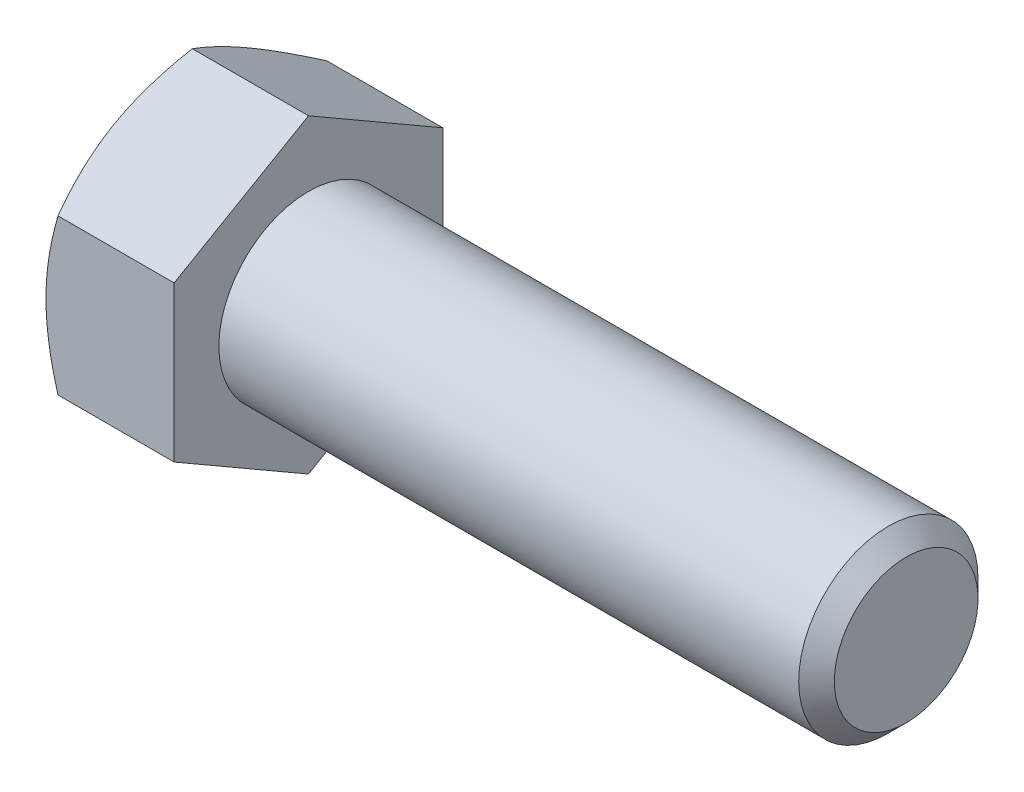
ISO-10303-21;
HEADER;
FILE_DESCRIPTION(('STEP AP214'),'2;1');
FILE_NAME('part.step','',(''),(''),'','','');
FILE_SCHEMA(('AUTOMOTIVE_DESIGN { 1 0 10303 214 1 1 1 1 }'));
ENDSEC;
DATA;
#1=APPLICATION_CONTEXT('core data for automotive mechanical design processes');
#2=APPLICATION_PROTOCOL_DEFINITION('international standard','automotive_design',2000,#1);
#3=PRODUCT_CONTEXT('',#1,'mechanical');
#4=PRODUCT('Part','Part','',(#3));
#5=PRODUCT_RELATED_PRODUCT_CATEGORY('part','',(#4));
#6=PRODUCT_DEFINITION_FORMATION('','',#4);
#7=PRODUCT_DEFINITION_CONTEXT('part definition',#1,'design');
#8=PRODUCT_DEFINITION('design','',#6,#7);
#9=PRODUCT_DEFINITION_SHAPE('','',#8);
#10=(LENGTH_UNIT() NAMED_UNIT(*) SI_UNIT(.MILLI.,.METRE.));
#11=(NAMED_UNIT(*) PLANE_ANGLE_UNIT() SI_UNIT($,.RADIAN.));
#12=(NAMED_UNIT(*) SI_UNIT($,.STERADIAN.) SOLID_ANGLE_UNIT());
#13=UNCERTAINTY_MEASURE_WITH_UNIT(LENGTH_MEASURE(1.E-05),#10,'distance_accuracy_value','');
#14=(GEOMETRIC_REPRESENTATION_CONTEXT(3) GLOBAL_UNCERTAINTY_ASSIGNED_CONTEXT((#13)) GLOBAL_UNIT_ASSIGNED_CONTEXT((#10,
#11,#12)) REPRESENTATION_CONTEXT('',''));
#15=CARTESIAN_POINT('',(0.,0.,0.));
#16=DIRECTION('',(0.,0.,1.));
#17=DIRECTION('',(1.,0.,0.));
#18=AXIS2_PLACEMENT_3D('',#15,#16,#17);
#19=CARTESIAN_POINT('',(6.8072,4.12077981131403,-7.1374));
#20=DIRECTION('',(0.,-0.866025403784438,0.500000000000001));
#21=DIRECTION('',(0.,-0.500000000000001,-0.866025403784438));
#22=AXIS2_PLACEMENT_3D('',#19,#20,#21);
#23=PLANE('',#22);
#24=CARTESIAN_POINT('',(0.637553523420348,8.24167509268191,0.000200000000000209));
#25=CARTESIAN_POINT('',(0.585265389565358,8.15109571898021,-0.15668807736911));
#26=CARTESIAN_POINT('',(0.535350289912886,8.06017862158373,-0.314161109336511));
#27=CARTESIAN_POINT('',(0.44091973939481,7.87760608276958,-0.63038602262945));
#28=CARTESIAN_POINT('',(0.396406617864103,7.78595034088604,-0.789138424377165));
#29=CARTESIAN_POINT('',(0.2718439466046,7.50951559742938,-1.26793744502137));
#30=CARTESIAN_POINT('',(0.200994122533561,7.32364541554993,-1.58987404364865));
#31=CARTESIAN_POINT('',(0.117914357261566,7.04549407114397,-2.07164630435335));
#32=CARTESIAN_POINT('',(0.0942473375753675,6.95404399131371,-2.23004248897558));
#33=CARTESIAN_POINT('',(0.0545611977075645,6.77073061920728,-2.54755056317072));
#34=CARTESIAN_POINT('',(0.0385414017966338,6.67886736416472,-2.70666238825308));
#35=CARTESIAN_POINT('',(0.0145579786669821,6.49498130931768,-3.02516237805154));
#36=CARTESIAN_POINT('',(0.00658520869042847,6.40295880983915,-3.18455002258784));
#37=CARTESIAN_POINT('',(-0.00114175893561545,6.21883388819856,-3.50346374180898));
#38=CARTESIAN_POINT('',(-0.000896210482461237,6.12673146859347,-3.66298981206503));
#39=CARTESIAN_POINT('',(0.0110730517201772,5.87440161908354,-4.10003793168242));
#40=CARTESIAN_POINT('',(0.0311658852990922,5.71425679021456,-4.37741691185292));
#41=CARTESIAN_POINT('',(0.0948800883359065,5.39503079963205,-4.93033254663833));
#42=CARTESIAN_POINT('',(0.13852323430896,5.23595076056063,-5.20586725678008));
#43=CARTESIAN_POINT('',(0.247618299095075,4.91608234409664,-5.75989560583231));
#44=CARTESIAN_POINT('',(0.31353243599271,4.75533432745402,-6.03831933787325));
#45=CARTESIAN_POINT('',(0.463130880450463,4.43623548204411,-6.59101475075978));
#46=CARTESIAN_POINT('',(0.546780048637372,4.27788056676996,-6.86529350964288));
#47=CARTESIAN_POINT('',(0.637553523420342,4.12066434126019,-7.1376));
#48=B_SPLINE_CURVE_WITH_KNOTS('',3,(#24,#25,#26,#27,#28,#29,#30,#31,#32,#33,#34,#35,#36,#37,#38,
#39,#40,#41,#42,#43,#44,#45,#46,#47),.UNSPECIFIED.,.F.,.F.,(4,2,2,2,2,2,2,2,2,2,2,4),(0.,
0.565616271543687,1.13147557690344,2.26554547664276,2.81869146049269,3.37178855781927,
3.9242565351942,4.4767074445971,5.43845614829341,6.40109569003607,7.3850851165131,
8.36714283329691),.UNSPECIFIED.);
#49=CARTESIAN_POINT('',(0.63748685535263,8.24155962262807,0.));
#50=VERTEX_POINT('',#49);
#51=CARTESIAN_POINT('',(0.,6.18116971697105,-3.56870000000001));
#52=VERTEX_POINT('',#51);
#53=EDGE_CURVE('E49',#50,#52,#48,.T.);
#54=ORIENTED_EDGE('',*,*,#53,.F.);
#55=DIRECTION('',(-1.,0.,0.));
#56=VECTOR('',#55,1.);
#57=CARTESIAN_POINT('',(6.8072,8.24155962262807,0.));
#58=LINE('',#57,#56);
#59=CARTESIAN_POINT('',(6.8072,8.24155962262807,0.));
#60=VERTEX_POINT('',#59);
#61=EDGE_CURVE('E145',#60,#50,#58,.T.);
#62=ORIENTED_EDGE('',*,*,#61,.F.);
#63=DIRECTION('',(0.,0.500000000000001,0.866025403784438));
#64=VECTOR('',#63,1.);
#65=CARTESIAN_POINT('',(6.8072,4.12077981131403,-7.1374));
#66=LINE('',#65,#64);
#67=CARTESIAN_POINT('',(6.8072,4.12077981131403,-7.1374));
#68=VERTEX_POINT('',#67);
#69=EDGE_CURVE('E230',#68,#60,#66,.T.);
#70=ORIENTED_EDGE('',*,*,#69,.F.);
#71=DIRECTION('',(-1.,0.,0.));
#72=VECTOR('',#71,1.);
#73=CARTESIAN_POINT('',(6.8072,4.12077981131403,-7.1374));
#74=LINE('',#73,#72);
#75=CARTESIAN_POINT('',(0.637486855352625,4.12077981131403,-7.1374));
#76=VERTEX_POINT('',#75);
#77=EDGE_CURVE('E133',#68,#76,#74,.T.);
#78=ORIENTED_EDGE('',*,*,#77,.T.);
#79=EDGE_CURVE('E127',#52,#76,#48,.T.);
#80=ORIENTED_EDGE('',*,*,#79,.F.);
#81=EDGE_LOOP('',(#54,#62,#70,#78,#80));
#82=FACE_BOUND('',#81,.T.);
#83=ADVANCED_FACE('F33',(#82),#23,.F.);
#84=CARTESIAN_POINT('',(6.8072,8.24155962262807,0.));
#85=DIRECTION('',(0.,-0.866025403784438,-0.500000000000001));
#86=DIRECTION('',(0.,0.500000000000001,-0.866025403784438));
#87=AXIS2_PLACEMENT_3D('',#84,#85,#86);
#88=PLANE('',#87);
#89=CARTESIAN_POINT('',(0.637553523420344,4.12066434126019,7.1376));
#90=CARTESIAN_POINT('',(0.585265389565354,4.21124371496189,6.98071192263089));
#91=CARTESIAN_POINT('',(0.535350289912882,4.30216081235838,6.82323889066349));
#92=CARTESIAN_POINT('',(0.440919739394807,4.48473335117252,6.50701397737055));
#93=CARTESIAN_POINT('',(0.3964066178641,4.57638909305606,6.34826157562283));
#94=CARTESIAN_POINT('',(0.271843946604597,4.85282383651273,5.86946255497863));
#95=CARTESIAN_POINT('',(0.200994122533559,5.03869401839218,5.54752595635135));
#96=CARTESIAN_POINT('',(0.117914357261565,5.31684536279813,5.06575369564665));
#97=CARTESIAN_POINT('',(0.0942473375753667,5.40829544262839,4.90735751102442));
#98=CARTESIAN_POINT('',(0.0545611977075642,5.59160881473483,4.58984943682929));
#99=CARTESIAN_POINT('',(0.0385414017966335,5.68347206977738,4.43073761174693));
#100=CARTESIAN_POINT('',(0.014557978666982,5.86735812462442,4.11223762194846));
#101=CARTESIAN_POINT('',(0.00658520869042849,5.95938062410295,3.95284997741216));
#102=CARTESIAN_POINT('',(-0.00114175893561497,6.14350554574354,3.63393625819102));
#103=CARTESIAN_POINT('',(-0.000896210482460466,6.23560796534863,3.47441018793497));
#104=CARTESIAN_POINT('',(0.0110730517201786,6.48793781485856,3.03736206831758));
#105=CARTESIAN_POINT('',(0.0311658852990939,6.64808264372754,2.75998308814708));
#106=CARTESIAN_POINT('',(0.0948800883359091,6.96730863431005,2.20706745336167));
#107=CARTESIAN_POINT('',(0.138523234308963,7.12638867338148,1.93153274321992));
#108=CARTESIAN_POINT('',(0.247618299095079,7.44625708984546,1.37750439416769));
#109=CARTESIAN_POINT('',(0.313532435992715,7.60700510648809,1.09908066212674));
#110=CARTESIAN_POINT('',(0.463130880450468,7.92610395189799,0.546385249240216));
#111=CARTESIAN_POINT('',(0.546780048637378,8.08445886717215,0.272106490357122));
#112=CARTESIAN_POINT('',(0.637553523420348,8.24167509268191,-0.000200000000000023));
#113=B_SPLINE_CURVE_WITH_KNOTS('',3,(#89,#90,#91,#92,#93,#94,#95,#96,#97,#98,#99,#100,#101,#102,
#103,#104,#105,#106,#107,#108,#109,#110,#111,#112),.UNSPECIFIED.,.F.,.F.,(4,2,2,2,2,2,2,2,2,2,2,
4),(0.,0.565616271543686,1.13147557690344,2.26554547664276,2.81869146049268,3.37178855781927,
3.92425653519419,4.4767074445971,5.43845614829341,6.40109569003607,7.3850851165131,
8.36714283329691),.UNSPECIFIED.);
#114=CARTESIAN_POINT('',(0.637486855352626,4.12077981131403,7.1374));
#115=VERTEX_POINT('',#114);
#116=CARTESIAN_POINT('',(0.,6.18116971697105,3.56870000000001));
#117=VERTEX_POINT('',#116);
#118=EDGE_CURVE('E56',#115,#117,#113,.T.);
#119=ORIENTED_EDGE('',*,*,#118,.F.);
#120=DIRECTION('',(-1.,0.,0.));
#121=VECTOR('',#120,1.);
#122=CARTESIAN_POINT('',(6.8072,4.12077981131403,7.1374));
#123=LINE('',#122,#121);
#124=CARTESIAN_POINT('',(6.8072,4.12077981131403,7.1374));
#125=VERTEX_POINT('',#124);
#126=EDGE_CURVE('E143',#125,#115,#123,.T.);
#127=ORIENTED_EDGE('',*,*,#126,.F.);
#128=DIRECTION('',(0.,-0.500000000000001,0.866025403784438));
#129=VECTOR('',#128,1.);
#130=CARTESIAN_POINT('',(6.8072,8.24155962262807,0.));
#131=LINE('',#130,#129);
#132=EDGE_CURVE('E228',#60,#125,#131,.T.);
#133=ORIENTED_EDGE('',*,*,#132,.F.);
#134=ORIENTED_EDGE('',*,*,#61,.T.);
#135=EDGE_CURVE('E160',#117,#50,#113,.T.);
#136=ORIENTED_EDGE('',*,*,#135,.F.);
#137=EDGE_LOOP('',(#119,#127,#133,#134,#136));
#138=FACE_BOUND('',#137,.T.);
#139=ADVANCED_FACE('F166',(#138),#88,.F.);
#140=CARTESIAN_POINT('',(6.8072,4.12077981131403,7.1374));
#141=DIRECTION('',(0.,0.,-1.));
#142=DIRECTION('',(-1.,0.,0.));
#143=AXIS2_PLACEMENT_3D('',#140,#141,#142);
#144=PLANE('',#143);
#145=CARTESIAN_POINT('',(3.51793891464087,-11.1403587268437,7.1374));
#146=CARTESIAN_POINT('',(3.36611761361542,-10.8279722926893,7.1374));
#147=CARTESIAN_POINT('',(3.21573167435817,-10.5148763007017,7.1374));
#148=CARTESIAN_POINT('',(2.91863653133452,-9.88688803265219,7.1374));
#149=CARTESIAN_POINT('',(2.77192789362364,-9.57199548909055,7.1374));
#150=CARTESIAN_POINT('',(2.48227074397641,-8.93844907707203,7.1374));
#151=CARTESIAN_POINT('',(2.33934643030355,-8.61978410734441,7.1374));
#152=CARTESIAN_POINT('',(2.05925336317275,-7.97994405772779,7.1374));
#153=CARTESIAN_POINT('',(1.92208434228598,-7.65876909529409,7.1374));
#154=CARTESIAN_POINT('',(1.65065378230837,-7.00284865103085,7.1374));
#155=CARTESIAN_POINT('',(1.51663374065787,-6.66800268560584,7.1374));
#156=CARTESIAN_POINT('',(1.25856485288051,-5.99442084818065,7.1374));
#157=CARTESIAN_POINT('',(1.13451711533335,-5.6556845484785,7.1374));
#158=CARTESIAN_POINT('',(0.899596727677592,-4.97438980758155,7.1374));
#159=CARTESIAN_POINT('',(0.788698036742921,-4.63184044199148,7.1374));
#160=CARTESIAN_POINT('',(0.583585288609216,-3.94184101121261,7.1374));
#161=CARTESIAN_POINT('',(0.489366053461916,-3.5943925031972,7.1374));
#162=CARTESIAN_POINT('',(0.32258511977529,-2.89623643412329,7.1374));
#163=CARTESIAN_POINT('',(0.249906108267923,-2.54555766855628,7.1374));
#164=CARTESIAN_POINT('',(0.160162927876227,-2.01629019056175,7.1374));
#165=CARTESIAN_POINT('',(0.133459926561135,-1.83931395899739,7.1374));
#166=CARTESIAN_POINT('',(0.0870009608751862,-1.48445773938035,7.1374));
#167=CARTESIAN_POINT('',(0.0672443235865576,-1.3065778405635,7.1374));
#168=CARTESIAN_POINT('',(0.0353233928817906,-0.952509042934673,7.1374));
#169=CARTESIAN_POINT('',(0.0230620606560365,-0.776328928434244,7.1374));
#170=CARTESIAN_POINT('',(0.00600431660240801,-0.423607840789672,7.1374));
#171=CARTESIAN_POINT('',(0.0012077787227121,-0.247066873789356,7.1374));
#172=CARTESIAN_POINT('',(-0.000805707966080995,0.106061109313541,7.1374));
#173=CARTESIAN_POINT('',(0.0019774074548587,0.282648125793665,7.1374));
#174=CARTESIAN_POINT('',(0.0150543642253245,0.635545980126706,7.1374));
#175=CARTESIAN_POINT('',(0.0253485677088153,0.811856804252738,7.1374));
#176=CARTESIAN_POINT('',(0.0587173546676623,1.23335791869126,7.1374));
#177=CARTESIAN_POINT('',(0.0852317102922988,1.47828183508494,7.1374));
#178=CARTESIAN_POINT('',(0.151325348901078,1.96634766484074,7.1374));
#179=CARTESIAN_POINT('',(0.190906342916657,2.20948934056,7.1374));
#180=CARTESIAN_POINT('',(0.327153349211707,2.93593608611635,7.1374));
#181=CARTESIAN_POINT('',(0.441300495017732,3.41600789467397,7.1374));
#182=CARTESIAN_POINT('',(0.639740105584513,4.1340978033711,7.1374));
#183=CARTESIAN_POINT('',(0.711386839279739,4.37582477933243,7.1374));
#184=CARTESIAN_POINT('',(0.862240726867137,4.85693123459408,7.1374));
#185=CARTESIAN_POINT('',(0.941447936163005,5.09631069667749,7.1374));
#186=CARTESIAN_POINT('',(1.10614180608764,5.57279746249284,7.1374));
#187=CARTESIAN_POINT('',(1.19162653724197,5.809905439274,7.1374));
#188=CARTESIAN_POINT('',(1.36785754588297,6.28214651090287,7.1374));
#189=CARTESIAN_POINT('',(1.4586037216663,6.51727964382365,7.1374));
#190=CARTESIAN_POINT('',(1.70099135878086,7.12822933634872,7.1374));
#191=CARTESIAN_POINT('',(1.85611245200932,7.50266378649048,7.1374));
#192=CARTESIAN_POINT('',(2.17492034788947,8.24788094227112,7.1374));
#193=CARTESIAN_POINT('',(2.338607954525,8.61866330125998,7.1374));
#194=CARTESIAN_POINT('',(2.67260301704527,9.35737269718075,7.1374));
#195=CARTESIAN_POINT('',(2.8429126440593,9.7252987493811,7.1374));
#196=CARTESIAN_POINT('',(3.18863367809308,10.4587232704181,7.1374));
#197=CARTESIAN_POINT('',(3.36404491157502,10.8242218213112,7.1374));
#198=CARTESIAN_POINT('',(3.7191549662705,11.553777334436,7.1374));
#199=CARTESIAN_POINT('',(3.89885959822867,11.9178314626509,7.1374));
#200=CARTESIAN_POINT('',(4.26150568432078,12.6443245246618,7.1374));
#201=CARTESIAN_POINT('',(4.44444716083244,13.0067634472695,7.1374));
#202=CARTESIAN_POINT('',(4.81291716764718,13.7302353242129,7.1374));
#203=CARTESIAN_POINT('',(4.99844519827985,14.0912685333268,7.1374));
#204=CARTESIAN_POINT('',(5.37165471040538,14.8122208146436,7.1374));
#205=CARTESIAN_POINT('',(5.55933620037513,15.1721398824536,7.1374));
#206=CARTESIAN_POINT('',(6.08751400276292,16.1789579520409,7.1374));
#207=CARTESIAN_POINT('',(6.43000254365915,16.8248116492745,7.1374));
#208=CARTESIAN_POINT('',(7.11919785487999,18.1143032770824,7.1374));
#209=CARTESIAN_POINT('',(7.46590484738288,18.7579410886393,7.1374));
#210=CARTESIAN_POINT('',(8.16140637459832,20.0415314633598,7.1374));
#211=CARTESIAN_POINT('',(8.51019123426675,20.6814892741017,7.1374));
#212=CARTESIAN_POINT('',(9.21019417047445,21.9600146152104,7.1374));
#213=CARTESIAN_POINT('',(9.56141207357471,22.598582240497,7.1374));
#214=CARTESIAN_POINT('',(9.9135191344137,23.2366555668876,7.1374));
#215=B_SPLINE_CURVE_WITH_KNOTS('',3,(#145,#146,#147,#148,#149,#150,#151,#152,#153,#154,#155,
#156,#157,#158,#159,#160,#161,#162,#163,#164,#165,#166,#167,#168,#169,#170,#171,#172,#173,#174,
#175,#176,#177,#178,#179,#180,#181,#182,#183,#184,#185,#186,#187,#188,#189,#190,#191,#192,#193,
#194,#195,#196,#197,#198,#199,#200,#201,#202,#203,#204,#205,#206,#207,#208,#209,#210,#211,#212,
#213,#214),.UNSPECIFIED.,.F.,.F.,(4,2,2,2,2,2,2,2,2,2,2,2,2,2,2,2,2,2,2,2,2,2,2,2,2,2,2,2,2,2,2,
2,2,2,4),(0.,1.0419888362068,2.08413709519682,3.13183784368231,4.17948985504911,
5.26137797247103,6.34338619307611,7.42321444996099,8.50270689628368,9.57620733057732,
10.113030795566,10.6498022423129,11.179468394122,11.7091256017988,12.2387872978086,
12.7684745322176,13.5071235743819,14.245869378494,15.7241255438818,16.4804246089875,
17.2367292167316,17.9928023300467,18.7488608333938,19.9645892594812,21.1804319893616,
22.3966767697582,23.6128802262777,24.8308351286452,26.0487984545625,27.2665296678531,
28.4842656762731,30.6773737382256,32.8705978115956,35.0570894097064,37.2434267159856),.UNSPECIFIED.);
#216=CARTESIAN_POINT('',(0.637486855352626,-4.12077981131403,7.1374));
#217=VERTEX_POINT('',#216);
#218=CARTESIAN_POINT('',(0.,0.,7.1374));
#219=VERTEX_POINT('',#218);
#220=EDGE_CURVE('E240',#217,#219,#215,.T.);
#221=ORIENTED_EDGE('',*,*,#220,.F.);
#222=DIRECTION('',(-1.,0.,0.));
#223=VECTOR('',#222,1.);
#224=CARTESIAN_POINT('',(6.8072,-4.12077981131403,7.1374));
#225=LINE('',#224,#223);
#226=CARTESIAN_POINT('',(6.8072,-4.12077981131403,7.1374));
#227=VERTEX_POINT('',#226);
#228=EDGE_CURVE('E135',#227,#217,#225,.T.);
#229=ORIENTED_EDGE('',*,*,#228,.F.);
#230=DIRECTION('',(0.,-1.,0.));
#231=VECTOR('',#230,1.);
#232=CARTESIAN_POINT('',(6.8072,4.12077981131403,7.1374));
#233=LINE('',#232,#231);
#234=EDGE_CURVE('E224',#125,#227,#233,.T.);
#235=ORIENTED_EDGE('',*,*,#234,.F.);
#236=ORIENTED_EDGE('',*,*,#126,.T.);
#237=EDGE_CURVE('E182',#219,#115,#215,.T.);
#238=ORIENTED_EDGE('',*,*,#237,.F.);
#239=EDGE_LOOP('',(#221,#229,#235,#236,#238));
#240=FACE_BOUND('',#239,.T.);
#241=ADVANCED_FACE('F246',(#240),#144,.F.);
#242=CARTESIAN_POINT('',(6.8072,-8.24155962262809,0.));
#243=DIRECTION('',(0.,0.866025403784438,-0.500000000000002));
#244=DIRECTION('',(0.,0.500000000000002,0.866025403784438));
#245=AXIS2_PLACEMENT_3D('',#242,#243,#244);
#246=PLANE('',#245);
#247=CARTESIAN_POINT('',(0.637553523420355,-8.24167509268193,-0.000200000000000038));
#248=CARTESIAN_POINT('',(0.585265389565365,-8.15109571898022,0.15668807736911));
#249=CARTESIAN_POINT('',(0.535350289912893,-8.06017862158374,0.314161109336512));
#250=CARTESIAN_POINT('',(0.440919739394817,-7.87760608276959,0.630386022629451));
#251=CARTESIAN_POINT('',(0.396406617864109,-7.78595034088605,0.789138424377166));
#252=CARTESIAN_POINT('',(0.271843946604605,-7.50951559742939,1.26793744502137));
#253=CARTESIAN_POINT('',(0.200994122533566,-7.32364541554994,1.58987404364865));
#254=CARTESIAN_POINT('',(0.117914357261572,-7.04549407114398,2.07164630435336));
#255=CARTESIAN_POINT('',(0.0942473375753728,-6.95404399131372,2.23004248897559));
#256=CARTESIAN_POINT('',(0.0545611977075693,-6.77073061920728,2.54755056317072));
#257=CARTESIAN_POINT('',(0.0385414017966381,-6.67886736416473,2.70666238825308));
#258=CARTESIAN_POINT('',(0.0145579786669859,-6.49498130931769,3.02516237805155));
#259=CARTESIAN_POINT('',(0.00658520869043238,-6.40295880983916,3.18455002258785));
#260=CARTESIAN_POINT('',(-0.00114175893561158,-6.21883388819857,3.50346374180899));
#261=CARTESIAN_POINT('',(-0.000896210482457587,-6.12673146859347,3.66298981206503));
#262=CARTESIAN_POINT('',(0.0110730517201805,-5.87440161908355,4.10003793168243));
#263=CARTESIAN_POINT('',(0.0311658852990955,-5.71425679021457,4.37741691185293));
#264=CARTESIAN_POINT('',(0.0948800883359098,-5.39503079963205,4.93033254663834));
#265=CARTESIAN_POINT('',(0.138523234308963,-5.23595076056063,5.20586725678009));
#266=CARTESIAN_POINT('',(0.247618299095078,-4.91608234409664,5.75989560583231));
#267=CARTESIAN_POINT('',(0.313532435992713,-4.75533432745402,6.03831933787326));
#268=CARTESIAN_POINT('',(0.463130880450465,-4.43623548204411,6.59101475075978));
#269=CARTESIAN_POINT('',(0.546780048637373,-4.27788056676996,6.86529350964288));
#270=CARTESIAN_POINT('',(0.637553523420343,-4.12066434126019,7.1376));
#271=B_SPLINE_CURVE_WITH_KNOTS('',3,(#247,#248,#249,#250,#251,#252,#253,#254,#255,#256,#257,
#258,#259,#260,#261,#262,#263,#264,#265,#266,#267,#268,#269,#270),.UNSPECIFIED.,.F.,.F.,(4,2,2,
2,2,2,2,2,2,2,2,4),(0.,0.565616271543688,1.13147557690344,2.26554547664277,2.81869146049269,
3.37178855781928,3.92425653519421,4.47670744459711,5.43845614829342,6.40109569003608,
7.38508511651311,8.36714283329692),.UNSPECIFIED.);
#272=CARTESIAN_POINT('',(0.637486855352638,-8.24155962262809,0.));
#273=VERTEX_POINT('',#272);
#274=CARTESIAN_POINT('',(0.,-6.18116971697104,3.56870000000001));
#275=VERTEX_POINT('',#274);
#276=EDGE_CURVE('E168',#273,#275,#271,.T.);
#277=ORIENTED_EDGE('',*,*,#276,.F.);
#278=DIRECTION('',(-1.,0.,0.));
#279=VECTOR('',#278,1.);
#280=CARTESIAN_POINT('',(6.8072,-8.24155962262809,0.));
#281=LINE('',#280,#279);
#282=CARTESIAN_POINT('',(6.8072,-8.24155962262809,0.));
#283=VERTEX_POINT('',#282);
#284=EDGE_CURVE('E132',#283,#273,#281,.T.);
#285=ORIENTED_EDGE('',*,*,#284,.F.);
#286=DIRECTION('',(0.,-0.500000000000002,-0.866025403784438));
#287=VECTOR('',#286,1.);
#288=CARTESIAN_POINT('',(6.8072,-8.24155962262809,0.));
#289=LINE('',#288,#287);
#290=EDGE_CURVE('E222',#227,#283,#289,.T.);
#291=ORIENTED_EDGE('',*,*,#290,.F.);
#292=ORIENTED_EDGE('',*,*,#228,.T.);
#293=EDGE_CURVE('E170',#275,#217,#271,.T.);
#294=ORIENTED_EDGE('',*,*,#293,.F.);
#295=EDGE_LOOP('',(#277,#285,#291,#292,#294));
#296=FACE_BOUND('',#295,.T.);
#297=ADVANCED_FACE('F218',(#296),#246,.F.);
#298=CARTESIAN_POINT('',(6.8072,-4.12077981131405,-7.1374));
#299=DIRECTION('',(0.,0.866025403784438,0.500000000000001));
#300=DIRECTION('',(0.,-0.500000000000001,0.866025403784438));
#301=AXIS2_PLACEMENT_3D('',#298,#299,#300);
#302=PLANE('',#301);
#303=CARTESIAN_POINT('',(0.637553523420348,-4.12066434126021,-7.1376));
#304=CARTESIAN_POINT('',(0.585265389565358,-4.21124371496191,-6.98071192263089));
#305=CARTESIAN_POINT('',(0.535350289912886,-4.30216081235839,-6.82323889066349));
#306=CARTESIAN_POINT('',(0.440919739394811,-4.48473335117254,-6.50701397737055));
#307=CARTESIAN_POINT('',(0.396406617864104,-4.57638909305608,-6.34826157562283));
#308=CARTESIAN_POINT('',(0.271843946604602,-4.85282383651274,-5.86946255497863));
#309=CARTESIAN_POINT('',(0.200994122533564,-5.03869401839219,-5.54752595635135));
#310=CARTESIAN_POINT('',(0.117914357261571,-5.31684536279815,-5.06575369564664));
#311=CARTESIAN_POINT('',(0.0942473375753719,-5.4082954426284,-4.90735751102441));
#312=CARTESIAN_POINT('',(0.0545611977075697,-5.59160881473484,-4.58984943682928));
#313=CARTESIAN_POINT('',(0.0385414017966394,-5.6834720697774,-4.43073761174692));
#314=CARTESIAN_POINT('',(0.0145579786669886,-5.86735812462444,-4.11223762194845));
#315=CARTESIAN_POINT('',(0.00658520869043526,-5.95938062410297,-3.95284997741216));
#316=CARTESIAN_POINT('',(-0.00114175893560797,-6.14350554574356,-3.63393625819102));
#317=CARTESIAN_POINT('',(-0.000896210482453403,-6.23560796534865,-3.47441018793497));
#318=CARTESIAN_POINT('',(0.0110730517201859,-6.48793781485857,-3.03736206831757));
#319=CARTESIAN_POINT('',(0.0311658852991012,-6.64808264372756,-2.75998308814708));
#320=CARTESIAN_POINT('',(0.0948800883359163,-6.96730863431007,-2.20706745336166));
#321=CARTESIAN_POINT('',(0.13852323430897,-7.12638867338149,-1.93153274321991));
#322=CARTESIAN_POINT('',(0.247618299095086,-7.44625708984548,-1.37750439416769));
#323=CARTESIAN_POINT('',(0.313532435992722,-7.6070051064881,-1.09908066212674));
#324=CARTESIAN_POINT('',(0.463130880450476,-7.92610395189801,-0.546385249240215));
#325=CARTESIAN_POINT('',(0.546780048637385,-8.08445886717216,-0.272106490357122));
#326=CARTESIAN_POINT('',(0.637553523420355,-8.24167509268193,0.000200000000000375));
#327=B_SPLINE_CURVE_WITH_KNOTS('',3,(#303,#304,#305,#306,#307,#308,#309,#310,#311,#312,#313,
#314,#315,#316,#317,#318,#319,#320,#321,#322,#323,#324,#325,#326),.UNSPECIFIED.,.F.,.F.,(4,2,2,
2,2,2,2,2,2,2,2,4),(0.,0.565616271543687,1.13147557690344,2.26554547664276,2.81869146049269,
3.37178855781927,3.9242565351942,4.47670744459711,5.43845614829341,6.40109569003608,
7.3850851165131,8.36714283329691),.UNSPECIFIED.);
#328=CARTESIAN_POINT('',(0.63748685535263,-4.12077981131405,-7.1374));
#329=VERTEX_POINT('',#328);
#330=CARTESIAN_POINT('',(0.,-6.18116971697105,-3.56870000000001));
#331=VERTEX_POINT('',#330);
#332=EDGE_CURVE('E109',#329,#331,#327,.T.);
#333=ORIENTED_EDGE('',*,*,#332,.F.);
#334=DIRECTION('',(-1.,0.,0.));
#335=VECTOR('',#334,1.);
#336=CARTESIAN_POINT('',(6.8072,-4.12077981131405,-7.1374));
#337=LINE('',#336,#335);
#338=CARTESIAN_POINT('',(6.8072,-4.12077981131405,-7.1374));
#339=VERTEX_POINT('',#338);
#340=EDGE_CURVE('E123',#339,#329,#337,.T.);
#341=ORIENTED_EDGE('',*,*,#340,.F.);
#342=DIRECTION('',(0.,0.500000000000001,-0.866025403784438));
#343=VECTOR('',#342,1.);
#344=CARTESIAN_POINT('',(6.8072,-4.12077981131405,-7.1374));
#345=LINE('',#344,#343);
#346=EDGE_CURVE('E220',#283,#339,#345,.T.);
#347=ORIENTED_EDGE('',*,*,#346,.F.);
#348=ORIENTED_EDGE('',*,*,#284,.T.);
#349=EDGE_CURVE('E126',#331,#273,#327,.T.);
#350=ORIENTED_EDGE('',*,*,#349,.F.);
#351=EDGE_LOOP('',(#333,#341,#347,#348,#350));
#352=FACE_BOUND('',#351,.T.);
#353=ADVANCED_FACE('F121',(#352),#302,.F.);
#354=CARTESIAN_POINT('',(6.8072,4.12077981131403,-7.1374));
#355=DIRECTION('',(0.,0.,1.));
#356=DIRECTION('',(1.,0.,0.));
#357=AXIS2_PLACEMENT_3D('',#354,#355,#356);
#358=PLANE('',#357);
#359=CARTESIAN_POINT('',(3.51793891464088,-11.1403587268438,-7.1374));
#360=CARTESIAN_POINT('',(3.36611761361543,-10.8279722926893,-7.1374));
#361=CARTESIAN_POINT('',(3.21573167435818,-10.5148763007017,-7.1374));
#362=CARTESIAN_POINT('',(2.91863653133453,-9.88688803265221,-7.1374));
#363=CARTESIAN_POINT('',(2.77192789362365,-9.57199548909056,-7.1374));
#364=CARTESIAN_POINT('',(2.48227074397642,-8.93844907707205,-7.1374));
#365=CARTESIAN_POINT('',(2.33934643030356,-8.61978410734443,-7.1374));
#366=CARTESIAN_POINT('',(2.05925336317276,-7.97994405772781,-7.1374));
#367=CARTESIAN_POINT('',(1.92208434228598,-7.65876909529411,-7.1374));
#368=CARTESIAN_POINT('',(1.65065378230838,-7.00284865103087,-7.1374));
#369=CARTESIAN_POINT('',(1.51663374065788,-6.66800268560586,-7.1374));
#370=CARTESIAN_POINT('',(1.25856485288052,-5.99442084818067,-7.1374));
#371=CARTESIAN_POINT('',(1.13451711533335,-5.65568454847852,-7.1374));
#372=CARTESIAN_POINT('',(0.899596727677598,-4.97438980758157,-7.1374));
#373=CARTESIAN_POINT('',(0.788698036742925,-4.6318404419915,-7.1374));
#374=CARTESIAN_POINT('',(0.58358528860922,-3.94184101121262,-7.1374));
#375=CARTESIAN_POINT('',(0.489366053461919,-3.59439250319721,-7.1374));
#376=CARTESIAN_POINT('',(0.322585119775293,-2.8962364341233,-7.1374));
#377=CARTESIAN_POINT('',(0.249906108267926,-2.54555766855629,-7.1374));
#378=CARTESIAN_POINT('',(0.160162927876228,-2.01629019056176,-7.1374));
#379=CARTESIAN_POINT('',(0.133459926561136,-1.8393139589974,-7.1374));
#380=CARTESIAN_POINT('',(0.0870009608751871,-1.48445773938036,-7.1374));
#381=CARTESIAN_POINT('',(0.0672443235865587,-1.30657784056351,-7.1374));
#382=CARTESIAN_POINT('',(0.0353233928817916,-0.952509042934685,-7.1374));
#383=CARTESIAN_POINT('',(0.0230620606560368,-0.776328928434256,-7.1374));
#384=CARTESIAN_POINT('',(0.00600431660240766,-0.423607840789684,-7.1374));
#385=CARTESIAN_POINT('',(0.00120777872271161,-0.247066873789368,-7.1374));
#386=CARTESIAN_POINT('',(-0.000805707966081502,0.106061109313529,-7.1374));
#387=CARTESIAN_POINT('',(0.0019774074548583,0.282648125793653,-7.1374));
#388=CARTESIAN_POINT('',(0.0150543642253239,0.635545980126694,-7.1374));
#389=CARTESIAN_POINT('',(0.0253485677088145,0.811856804252727,-7.1374));
#390=CARTESIAN_POINT('',(0.0587173546676609,1.23335791869125,-7.1374));
#391=CARTESIAN_POINT('',(0.0852317102922971,1.47828183508493,-7.1374));
#392=CARTESIAN_POINT('',(0.151325348901076,1.96634766484072,-7.1374));
#393=CARTESIAN_POINT('',(0.190906342916654,2.20948934055998,-7.1374));
#394=CARTESIAN_POINT('',(0.327153349211703,2.93593608611633,-7.1374));
#395=CARTESIAN_POINT('',(0.441300495017728,3.41600789467395,-7.1374));
#396=CARTESIAN_POINT('',(0.639740105584508,4.13409780337109,-7.1374));
#397=CARTESIAN_POINT('',(0.711386839279734,4.37582477933241,-7.1374));
#398=CARTESIAN_POINT('',(0.862240726867132,4.85693123459406,-7.1374));
#399=CARTESIAN_POINT('',(0.941447936163,5.09631069667747,-7.1374));
#400=CARTESIAN_POINT('',(1.10614180608763,5.57279746249282,-7.1374));
#401=CARTESIAN_POINT('',(1.19162653724196,5.80990543927398,-7.1374));
#402=CARTESIAN_POINT('',(1.36785754588296,6.28214651090285,-7.1374));
#403=CARTESIAN_POINT('',(1.4586037216663,6.51727964382363,-7.1374));
#404=CARTESIAN_POINT('',(1.70099135878085,7.1282293363487,-7.1374));
#405=CARTESIAN_POINT('',(1.85611245200931,7.50266378649047,-7.1374));
#406=CARTESIAN_POINT('',(2.17492034788946,8.2478809422711,-7.1374));
#407=CARTESIAN_POINT('',(2.33860795452499,8.61866330125997,-7.1374));
#408=CARTESIAN_POINT('',(2.67260301704526,9.35737269718074,-7.1374));
#409=CARTESIAN_POINT('',(2.8429126440593,9.72529874938109,-7.1374));
#410=CARTESIAN_POINT('',(3.18863367809308,10.4587232704181,-7.1374));
#411=CARTESIAN_POINT('',(3.36404491157502,10.8242218213112,-7.1374));
#412=CARTESIAN_POINT('',(3.7191549662705,11.553777334436,-7.1374));
#413=CARTESIAN_POINT('',(3.89885959822867,11.9178314626509,-7.1374));
#414=CARTESIAN_POINT('',(4.26150568432078,12.6443245246618,-7.1374));
#415=CARTESIAN_POINT('',(4.44444716083244,13.0067634472695,-7.1374));
#416=CARTESIAN_POINT('',(4.81291716764717,13.7302353242129,-7.1374));
#417=CARTESIAN_POINT('',(4.99844519827985,14.0912685333268,-7.1374));
#418=CARTESIAN_POINT('',(5.37165471040538,14.8122208146436,-7.1374));
#419=CARTESIAN_POINT('',(5.55933620037513,15.1721398824536,-7.1374));
#420=CARTESIAN_POINT('',(6.08751400276292,16.1789579520409,-7.1374));
#421=CARTESIAN_POINT('',(6.43000254365915,16.8248116492745,-7.1374));
#422=CARTESIAN_POINT('',(7.11919785487999,18.1143032770824,-7.1374));
#423=CARTESIAN_POINT('',(7.46590484738288,18.7579410886393,-7.1374));
#424=CARTESIAN_POINT('',(8.16140637459832,20.0415314633598,-7.1374));
#425=CARTESIAN_POINT('',(8.51019123426675,20.6814892741017,-7.1374));
#426=CARTESIAN_POINT('',(9.21019417047446,21.9600146152104,-7.1374));
#427=CARTESIAN_POINT('',(9.56141207357472,22.598582240497,-7.1374));
#428=CARTESIAN_POINT('',(9.9135191344137,23.2366555668876,-7.1374));
#429=B_SPLINE_CURVE_WITH_KNOTS('',3,(#359,#360,#361,#362,#363,#364,#365,#366,#367,#368,#369,
#370,#371,#372,#373,#374,#375,#376,#377,#378,#379,#380,#381,#382,#383,#384,#385,#386,#387,#388,
#389,#390,#391,#392,#393,#394,#395,#396,#397,#398,#399,#400,#401,#402,#403,#404,#405,#406,#407,
#408,#409,#410,#411,#412,#413,#414,#415,#416,#417,#418,#419,#420,#421,#422,#423,#424,#425,#426,
#427,#428),.UNSPECIFIED.,.F.,.F.,(4,2,2,2,2,2,2,2,2,2,2,2,2,2,2,2,2,2,2,2,2,2,2,2,2,2,2,2,2,2,2,
2,2,2,4),(0.,1.0419888362068,2.08413709519682,3.13183784368231,4.17948985504911,
5.26137797247103,6.34338619307611,7.42321444996099,8.50270689628369,9.57620733057733,
10.113030795566,10.6498022423129,11.179468394122,11.7091256017988,12.2387872978086,
12.7684745322176,13.507123574382,14.245869378494,15.7241255438818,16.4804246089875,
17.2367292167316,17.9928023300467,18.7488608333938,19.9645892594812,21.1804319893616,
22.3966767697582,23.6128802262777,24.8308351286452,26.0487984545625,27.2665296678531,
28.4842656762731,30.6773737382256,32.8705978115956,35.0570894097065,37.2434267159856),.UNSPECIFIED.);
#430=CARTESIAN_POINT('',(0.,0.,-7.1374));
#431=VERTEX_POINT('',#430);
#432=EDGE_CURVE('E115',#76,#431,#429,.F.);
#433=ORIENTED_EDGE('',*,*,#432,.F.);
#434=ORIENTED_EDGE('',*,*,#77,.F.);
#435=DIRECTION('',(0.,1.,0.));
#436=VECTOR('',#435,1.);
#437=CARTESIAN_POINT('',(6.8072,4.12077981131403,-7.1374));
#438=LINE('',#437,#436);
#439=EDGE_CURVE('E131',#339,#68,#438,.T.);
#440=ORIENTED_EDGE('',*,*,#439,.F.);
#441=ORIENTED_EDGE('',*,*,#340,.T.);
#442=EDGE_CURVE('E106',#431,#329,#429,.F.);
#443=ORIENTED_EDGE('',*,*,#442,.F.);
#444=EDGE_LOOP('',(#433,#434,#440,#441,#443));
#445=FACE_BOUND('',#444,.T.);
#446=ADVANCED_FACE('F129',(#445),#358,.F.);
#447=CARTESIAN_POINT('',(6.8072,8.24155962262807,0.));
#448=DIRECTION('',(1.,0.,0.));
#449=DIRECTION('',(0.,0.,-1.));
#450=AXIS2_PLACEMENT_3D('',#447,#448,#449);
#451=PLANE('',#450);
#452=CARTESIAN_POINT('',(6.8072,0.,0.));
#453=DIRECTION('',(1.,0.,0.));
#454=DIRECTION('',(0.,0.,-1.));
#455=AXIS2_PLACEMENT_3D('',#452,#453,#454);
#456=CIRCLE('',#455,4.7625);
#457=CARTESIAN_POINT('',(6.8072,0.,-4.7625));
#458=VERTEX_POINT('',#457);
#459=EDGE_CURVE('E233',#458,#458,#456,.F.);
#460=ORIENTED_EDGE('',*,*,#459,.T.);
#461=EDGE_LOOP('',(#460));
#462=FACE_BOUND('',#461,.T.);
#463=ORIENTED_EDGE('',*,*,#69,.T.);
#464=ORIENTED_EDGE('',*,*,#132,.T.);
#465=ORIENTED_EDGE('',*,*,#234,.T.);
#466=ORIENTED_EDGE('',*,*,#290,.T.);
#467=ORIENTED_EDGE('',*,*,#346,.T.);
#468=ORIENTED_EDGE('',*,*,#439,.T.);
#469=EDGE_LOOP('',(#463,#464,#465,#466,#467,#468));
#470=FACE_BOUND('',#469,.T.);
#471=ADVANCED_FACE('F248',(#462,#470),#451,.T.);
#472=CARTESIAN_POINT('',(0.,0.,0.));
#473=DIRECTION('',(-1.,0.,0.));
#474=DIRECTION('',(0.,0.,1.));
#475=AXIS2_PLACEMENT_3D('',#472,#473,#474);
#476=CYLINDRICAL_SURFACE('',#475,4.7625);
#477=ORIENTED_EDGE('',*,*,#459,.F.);
#478=EDGE_LOOP('',(#477));
#479=FACE_BOUND('',#478,.T.);
#480=CARTESIAN_POINT('',(37.61105,0.,0.));
#481=DIRECTION('',(-1.,0.,0.));
#482=DIRECTION('',(0.,0.,1.));
#483=AXIS2_PLACEMENT_3D('',#480,#481,#482);
#484=CIRCLE('',#483,4.7625);
#485=CARTESIAN_POINT('',(37.61105,0.,4.7625));
#486=VERTEX_POINT('',#485);
#487=EDGE_CURVE('E236',#486,#486,#484,.T.);
#488=ORIENTED_EDGE('',*,*,#487,.T.);
#489=EDGE_LOOP('',(#488));
#490=FACE_BOUND('',#489,.T.);
#491=ADVANCED_FACE('F279',(#479,#490),#476,.T.);
#492=CARTESIAN_POINT('',(38.5572,0.,0.));
#493=DIRECTION('',(-1.,0.,0.));
#494=DIRECTION('',(0.,0.,1.));
#495=AXIS2_PLACEMENT_3D('',#492,#493,#494);
#496=CONICAL_SURFACE('',#495,3.81635,0.785398163397437);
#497=ORIENTED_EDGE('',*,*,#487,.F.);
#498=EDGE_LOOP('',(#497));
#499=FACE_BOUND('',#498,.T.);
#500=CARTESIAN_POINT('',(38.5572,0.,0.));
#501=DIRECTION('',(-1.,0.,0.));
#502=DIRECTION('',(0.,0.,1.));
#503=AXIS2_PLACEMENT_3D('',#500,#501,#502);
#504=CIRCLE('',#503,3.81635);
#505=CARTESIAN_POINT('',(38.5572,0.,3.81635));
#506=VERTEX_POINT('',#505);
#507=EDGE_CURVE('E238',#506,#506,#504,.T.);
#508=ORIENTED_EDGE('',*,*,#507,.T.);
#509=EDGE_LOOP('',(#508));
#510=FACE_BOUND('',#509,.T.);
#511=ADVANCED_FACE('F282',(#499,#510),#496,.T.);
#512=CARTESIAN_POINT('',(38.5572,0.,0.));
#513=DIRECTION('',(-1.,0.,0.));
#514=DIRECTION('',(0.,0.,1.));
#515=AXIS2_PLACEMENT_3D('',#512,#513,#514);
#516=PLANE('',#515);
#517=ORIENTED_EDGE('',*,*,#507,.F.);
#518=EDGE_LOOP('',(#517));
#519=FACE_BOUND('',#518,.T.);
#520=ADVANCED_FACE('F195',(#519),#516,.F.);
#521=CARTESIAN_POINT('',(0.,0.,0.));
#522=DIRECTION('',(1.,0.,0.));
#523=DIRECTION('',(0.,0.,-1.));
#524=AXIS2_PLACEMENT_3D('',#521,#522,#523);
#525=CONICAL_SURFACE('',#524,7.1374,1.0471975511966);
#526=ORIENTED_EDGE('',*,*,#332,.T.);
#527=CARTESIAN_POINT('',(0.,0.,0.));
#528=DIRECTION('',(1.,0.,0.));
#529=DIRECTION('',(0.,0.,-1.));
#530=AXIS2_PLACEMENT_3D('',#527,#528,#529);
#531=CIRCLE('',#530,7.1374);
#532=EDGE_CURVE('E37',#331,#431,#531,.T.);
#533=ORIENTED_EDGE('',*,*,#532,.T.);
#534=ORIENTED_EDGE('',*,*,#442,.T.);
#535=EDGE_LOOP('',(#526,#533,#534));
#536=FACE_BOUND('',#535,.T.);
#537=ADVANCED_FACE('F108',(#536),#525,.T.);
#538=ORIENTED_EDGE('',*,*,#276,.T.);
#539=EDGE_CURVE('E150',#275,#331,#531,.T.);
#540=ORIENTED_EDGE('',*,*,#539,.T.);
#541=ORIENTED_EDGE('',*,*,#349,.T.);
#542=EDGE_LOOP('',(#538,#540,#541));
#543=FACE_BOUND('',#542,.T.);
#544=ADVANCED_FACE('F194',(#543),#525,.T.);
#545=ORIENTED_EDGE('',*,*,#220,.T.);
#546=EDGE_CURVE('E151',#219,#275,#531,.T.);
#547=ORIENTED_EDGE('',*,*,#546,.T.);
#548=ORIENTED_EDGE('',*,*,#293,.T.);
#549=EDGE_LOOP('',(#545,#547,#548));
#550=FACE_BOUND('',#549,.T.);
#551=ADVANCED_FACE('F189',(#550),#525,.T.);
#552=ORIENTED_EDGE('',*,*,#237,.T.);
#553=ORIENTED_EDGE('',*,*,#118,.T.);
#554=CARTESIAN_POINT('',(0.,0.,0.));
#555=DIRECTION('',(-1.,0.,0.));
#556=DIRECTION('',(0.,0.,1.));
#557=AXIS2_PLACEMENT_3D('',#554,#555,#556);
#558=CIRCLE('',#557,7.1374);
#559=EDGE_CURVE('E116',#219,#117,#558,.T.);
#560=ORIENTED_EDGE('',*,*,#559,.F.);
#561=EDGE_LOOP('',(#552,#553,#560));
#562=FACE_BOUND('',#561,.T.);
#563=ADVANCED_FACE('F193',(#562),#525,.T.);
#564=ORIENTED_EDGE('',*,*,#135,.T.);
#565=ORIENTED_EDGE('',*,*,#53,.T.);
#566=EDGE_CURVE('E42',#52,#117,#531,.T.);
#567=ORIENTED_EDGE('',*,*,#566,.T.);
#568=EDGE_LOOP('',(#564,#565,#567));
#569=FACE_BOUND('',#568,.T.);
#570=ADVANCED_FACE('F159',(#569),#525,.T.);
#571=ORIENTED_EDGE('',*,*,#79,.T.);
#572=ORIENTED_EDGE('',*,*,#432,.T.);
#573=EDGE_CURVE('E11',#431,#52,#531,.T.);
#574=ORIENTED_EDGE('',*,*,#573,.T.);
#575=EDGE_LOOP('',(#571,#572,#574));
#576=FACE_BOUND('',#575,.T.);
#577=ADVANCED_FACE('F251',(#576),#525,.T.);
#578=CARTESIAN_POINT('',(0.,8.24155962262807,0.));
#579=DIRECTION('',(1.,0.,0.));
#580=DIRECTION('',(0.,0.,-1.));
#581=AXIS2_PLACEMENT_3D('',#578,#579,#580);
#582=PLANE('',#581);
#583=ORIENTED_EDGE('',*,*,#573,.F.);
#584=ORIENTED_EDGE('',*,*,#532,.F.);
#585=ORIENTED_EDGE('',*,*,#539,.F.);
#586=ORIENTED_EDGE('',*,*,#546,.F.);
#587=ORIENTED_EDGE('',*,*,#559,.T.);
#588=ORIENTED_EDGE('',*,*,#566,.F.);
#589=EDGE_LOOP('',(#583,#584,#585,#586,#587,#588));
#590=FACE_BOUND('',#589,.T.);
#591=ADVANCED_FACE('F163',(#590),#582,.F.);
#592=CLOSED_SHELL('',(#83,#139,#241,#297,#353,#446,#471,#491,#511,#520,#537,#544,#551,#563,#570,
#577,#591));
#593=MANIFOLD_SOLID_BREP('B2',#592);
#594=ADVANCED_BREP_SHAPE_REPRESENTATION('',(#18,#593),#14);
#595=SHAPE_DEFINITION_REPRESENTATION(#9,#594);
ENDSEC;
END-ISO-10303-21;
